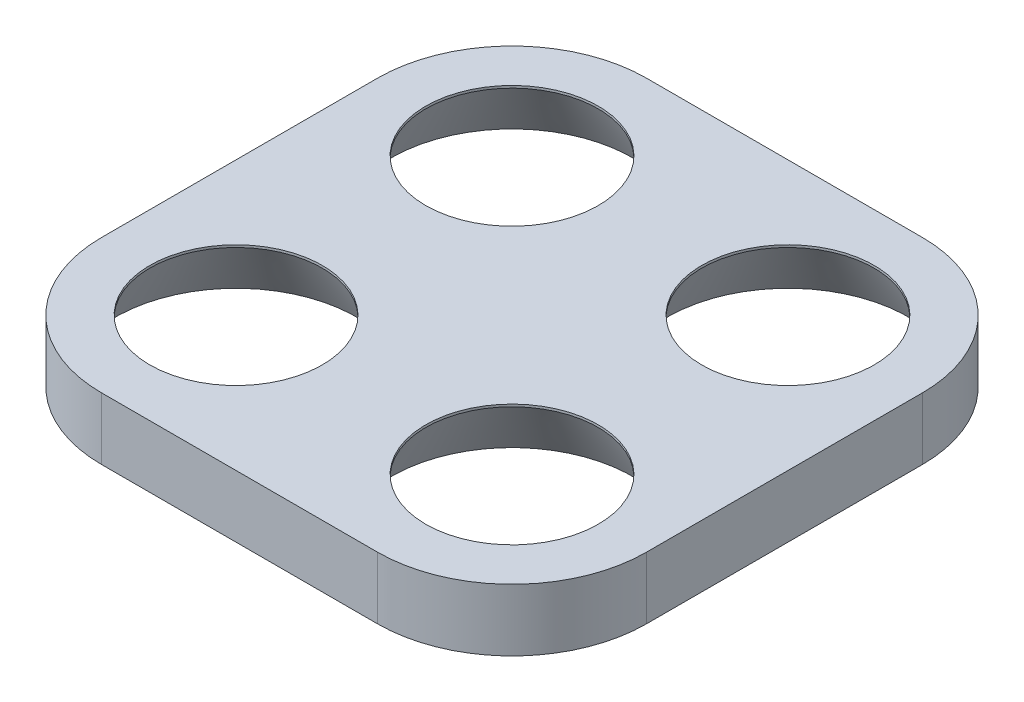
ISO-10303-21;
HEADER;
FILE_DESCRIPTION(('STEP AP214'),'2;1');
FILE_NAME('part.step','',(''),(''),'','','');
FILE_SCHEMA(('AUTOMOTIVE_DESIGN { 1 0 10303 214 1 1 1 1 }'));
ENDSEC;
DATA;
#1=APPLICATION_CONTEXT('core data for automotive mechanical design processes');
#2=APPLICATION_PROTOCOL_DEFINITION('international standard','automotive_design',2000,#1);
#3=PRODUCT_CONTEXT('',#1,'mechanical');
#4=PRODUCT('Part','Part','',(#3));
#5=PRODUCT_RELATED_PRODUCT_CATEGORY('part','',(#4));
#6=PRODUCT_DEFINITION_FORMATION('','',#4);
#7=PRODUCT_DEFINITION_CONTEXT('part definition',#1,'design');
#8=PRODUCT_DEFINITION('design','',#6,#7);
#9=PRODUCT_DEFINITION_SHAPE('','',#8);
#10=(LENGTH_UNIT() NAMED_UNIT(*) SI_UNIT(.MILLI.,.METRE.));
#11=(NAMED_UNIT(*) PLANE_ANGLE_UNIT() SI_UNIT($,.RADIAN.));
#12=(NAMED_UNIT(*) SI_UNIT($,.STERADIAN.) SOLID_ANGLE_UNIT());
#13=UNCERTAINTY_MEASURE_WITH_UNIT(LENGTH_MEASURE(1.E-05),#10,'distance_accuracy_value','');
#14=(GEOMETRIC_REPRESENTATION_CONTEXT(3) GLOBAL_UNCERTAINTY_ASSIGNED_CONTEXT((#13)) GLOBAL_UNIT_ASSIGNED_CONTEXT((#10,
#11,#12)) REPRESENTATION_CONTEXT('',''));
#15=CARTESIAN_POINT('',(0.,0.,0.));
#16=DIRECTION('',(0.,0.,1.));
#17=DIRECTION('',(1.,0.,0.));
#18=AXIS2_PLACEMENT_3D('',#15,#16,#17);
#19=CARTESIAN_POINT('',(-7.9,1.8,7.9));
#20=DIRECTION('',(1.,0.,0.));
#21=DIRECTION('',(0.,0.,-1.));
#22=AXIS2_PLACEMENT_3D('',#19,#20,#21);
#23=PLANE('',#22);
#24=DIRECTION('',(0.,0.,1.));
#25=VECTOR('',#24,1.);
#26=CARTESIAN_POINT('',(-7.9,0.,7.9));
#27=LINE('',#26,#25);
#28=CARTESIAN_POINT('',(-7.9,0.,-4.));
#29=VERTEX_POINT('',#28);
#30=CARTESIAN_POINT('',(-7.9,0.,4.));
#31=VERTEX_POINT('',#30);
#32=EDGE_CURVE('E127',#29,#31,#27,.T.);
#33=ORIENTED_EDGE('',*,*,#32,.T.);
#34=DIRECTION('',(0.,-1.,0.));
#35=VECTOR('',#34,1.);
#36=CARTESIAN_POINT('',(-7.9,1.8,4.));
#37=LINE('',#36,#35);
#38=CARTESIAN_POINT('',(-7.9,1.8,4.));
#39=VERTEX_POINT('',#38);
#40=EDGE_CURVE('E105',#31,#39,#37,.F.);
#41=ORIENTED_EDGE('',*,*,#40,.T.);
#42=DIRECTION('',(0.,0.,1.));
#43=VECTOR('',#42,1.);
#44=CARTESIAN_POINT('',(-7.9,1.8,7.9));
#45=LINE('',#44,#43);
#46=CARTESIAN_POINT('',(-7.9,1.8,-4.));
#47=VERTEX_POINT('',#46);
#48=EDGE_CURVE('E137',#47,#39,#45,.T.);
#49=ORIENTED_EDGE('',*,*,#48,.F.);
#50=DIRECTION('',(0.,-1.,0.));
#51=VECTOR('',#50,1.);
#52=CARTESIAN_POINT('',(-7.9,1.8,-4.));
#53=LINE('',#52,#51);
#54=EDGE_CURVE('E110',#47,#29,#53,.T.);
#55=ORIENTED_EDGE('',*,*,#54,.T.);
#56=EDGE_LOOP('',(#33,#41,#49,#55));
#57=FACE_BOUND('',#56,.T.);
#58=ADVANCED_FACE('F33',(#57),#23,.F.);
#59=CARTESIAN_POINT('',(7.9,1.8,7.9));
#60=DIRECTION('',(0.,0.,-1.));
#61=DIRECTION('',(-1.,0.,0.));
#62=AXIS2_PLACEMENT_3D('',#59,#60,#61);
#63=PLANE('',#62);
#64=DIRECTION('',(1.,0.,0.));
#65=VECTOR('',#64,1.);
#66=CARTESIAN_POINT('',(7.9,1.8,7.9));
#67=LINE('',#66,#65);
#68=CARTESIAN_POINT('',(-4.,1.8,7.9));
#69=VERTEX_POINT('',#68);
#70=CARTESIAN_POINT('',(4.,1.8,7.9));
#71=VERTEX_POINT('',#70);
#72=EDGE_CURVE('E120',#69,#71,#67,.T.);
#73=ORIENTED_EDGE('',*,*,#72,.F.);
#74=DIRECTION('',(0.,-1.,0.));
#75=VECTOR('',#74,1.);
#76=CARTESIAN_POINT('',(-4.,1.8,7.9));
#77=LINE('',#76,#75);
#78=CARTESIAN_POINT('',(-4.,0.,7.9));
#79=VERTEX_POINT('',#78);
#80=EDGE_CURVE('E104',#69,#79,#77,.T.);
#81=ORIENTED_EDGE('',*,*,#80,.T.);
#82=DIRECTION('',(1.,0.,0.));
#83=VECTOR('',#82,1.);
#84=CARTESIAN_POINT('',(7.9,0.,7.9));
#85=LINE('',#84,#83);
#86=CARTESIAN_POINT('',(4.,0.,7.9));
#87=VERTEX_POINT('',#86);
#88=EDGE_CURVE('E117',#79,#87,#85,.T.);
#89=ORIENTED_EDGE('',*,*,#88,.T.);
#90=DIRECTION('',(0.,-1.,0.));
#91=VECTOR('',#90,1.);
#92=CARTESIAN_POINT('',(4.,1.8,7.9));
#93=LINE('',#92,#91);
#94=EDGE_CURVE('E122',#87,#71,#93,.F.);
#95=ORIENTED_EDGE('',*,*,#94,.T.);
#96=EDGE_LOOP('',(#73,#81,#89,#95));
#97=FACE_BOUND('',#96,.T.);
#98=ADVANCED_FACE('F116',(#97),#63,.F.);
#99=CARTESIAN_POINT('',(7.9,1.8,7.9));
#100=DIRECTION('',(-1.,0.,0.));
#101=DIRECTION('',(0.,0.,1.));
#102=AXIS2_PLACEMENT_3D('',#99,#100,#101);
#103=PLANE('',#102);
#104=DIRECTION('',(0.,0.,-1.));
#105=VECTOR('',#104,1.);
#106=CARTESIAN_POINT('',(7.9,1.8,7.9));
#107=LINE('',#106,#105);
#108=CARTESIAN_POINT('',(7.9,1.8,4.));
#109=VERTEX_POINT('',#108);
#110=CARTESIAN_POINT('',(7.9,1.8,-4.));
#111=VERTEX_POINT('',#110);
#112=EDGE_CURVE('E254',#109,#111,#107,.T.);
#113=ORIENTED_EDGE('',*,*,#112,.F.);
#114=DIRECTION('',(0.,-1.,0.));
#115=VECTOR('',#114,1.);
#116=CARTESIAN_POINT('',(7.9,1.8,4.));
#117=LINE('',#116,#115);
#118=CARTESIAN_POINT('',(7.9,0.,4.));
#119=VERTEX_POINT('',#118);
#120=EDGE_CURVE('E156',#109,#119,#117,.T.);
#121=ORIENTED_EDGE('',*,*,#120,.T.);
#122=DIRECTION('',(0.,0.,-1.));
#123=VECTOR('',#122,1.);
#124=CARTESIAN_POINT('',(7.9,0.,7.9));
#125=LINE('',#124,#123);
#126=CARTESIAN_POINT('',(7.9,0.,-4.));
#127=VERTEX_POINT('',#126);
#128=EDGE_CURVE('E126',#119,#127,#125,.T.);
#129=ORIENTED_EDGE('',*,*,#128,.T.);
#130=DIRECTION('',(0.,-1.,0.));
#131=VECTOR('',#130,1.);
#132=CARTESIAN_POINT('',(7.9,1.8,-4.));
#133=LINE('',#132,#131);
#134=EDGE_CURVE('E154',#127,#111,#133,.F.);
#135=ORIENTED_EDGE('',*,*,#134,.T.);
#136=EDGE_LOOP('',(#113,#121,#129,#135));
#137=FACE_BOUND('',#136,.T.);
#138=ADVANCED_FACE('F205',(#137),#103,.F.);
#139=CARTESIAN_POINT('',(7.9,1.8,-7.9));
#140=DIRECTION('',(0.,0.,1.));
#141=DIRECTION('',(1.,0.,0.));
#142=AXIS2_PLACEMENT_3D('',#139,#140,#141);
#143=PLANE('',#142);
#144=DIRECTION('',(-1.,0.,0.));
#145=VECTOR('',#144,1.);
#146=CARTESIAN_POINT('',(7.9,1.8,-7.9));
#147=LINE('',#146,#145);
#148=CARTESIAN_POINT('',(4.,1.8,-7.9));
#149=VERTEX_POINT('',#148);
#150=CARTESIAN_POINT('',(-4.,1.8,-7.9));
#151=VERTEX_POINT('',#150);
#152=EDGE_CURVE('E138',#149,#151,#147,.T.);
#153=ORIENTED_EDGE('',*,*,#152,.F.);
#154=DIRECTION('',(0.,-1.,0.));
#155=VECTOR('',#154,1.);
#156=CARTESIAN_POINT('',(4.,1.8,-7.9));
#157=LINE('',#156,#155);
#158=CARTESIAN_POINT('',(4.,0.,-7.9));
#159=VERTEX_POINT('',#158);
#160=EDGE_CURVE('E160',#149,#159,#157,.T.);
#161=ORIENTED_EDGE('',*,*,#160,.T.);
#162=DIRECTION('',(-1.,0.,0.));
#163=VECTOR('',#162,1.);
#164=CARTESIAN_POINT('',(7.9,0.,-7.9));
#165=LINE('',#164,#163);
#166=CARTESIAN_POINT('',(-4.,0.,-7.9));
#167=VERTEX_POINT('',#166);
#168=EDGE_CURVE('E130',#159,#167,#165,.T.);
#169=ORIENTED_EDGE('',*,*,#168,.T.);
#170=DIRECTION('',(0.,-1.,0.));
#171=VECTOR('',#170,1.);
#172=CARTESIAN_POINT('',(-4.,1.8,-7.9));
#173=LINE('',#172,#171);
#174=EDGE_CURVE('E48',#167,#151,#173,.F.);
#175=ORIENTED_EDGE('',*,*,#174,.T.);
#176=EDGE_LOOP('',(#153,#161,#169,#175));
#177=FACE_BOUND('',#176,.T.);
#178=ADVANCED_FACE('F261',(#177),#143,.F.);
#179=CARTESIAN_POINT('',(0.,1.8,0.));
#180=DIRECTION('',(0.,1.,0.));
#181=DIRECTION('',(0.,0.,1.));
#182=AXIS2_PLACEMENT_3D('',#179,#180,#181);
#183=PLANE('',#182);
#184=CARTESIAN_POINT('',(-4.,1.8,4.));
#185=DIRECTION('',(0.,1.,0.));
#186=DIRECTION('',(0.,0.,1.));
#187=AXIS2_PLACEMENT_3D('',#184,#185,#186);
#188=CIRCLE('',#187,2.5);
#189=CARTESIAN_POINT('',(-4.,1.8,6.5));
#190=VERTEX_POINT('',#189);
#191=EDGE_CURVE('E246',#190,#190,#188,.T.);
#192=ORIENTED_EDGE('',*,*,#191,.F.);
#193=EDGE_LOOP('',(#192));
#194=FACE_BOUND('',#193,.T.);
#195=CARTESIAN_POINT('',(4.,1.8,4.));
#196=DIRECTION('',(0.,1.,0.));
#197=DIRECTION('',(0.,0.,1.));
#198=AXIS2_PLACEMENT_3D('',#195,#196,#197);
#199=CIRCLE('',#198,2.5);
#200=CARTESIAN_POINT('',(4.,1.8,6.5));
#201=VERTEX_POINT('',#200);
#202=EDGE_CURVE('E241',#201,#201,#199,.T.);
#203=ORIENTED_EDGE('',*,*,#202,.F.);
#204=EDGE_LOOP('',(#203));
#205=FACE_BOUND('',#204,.T.);
#206=CARTESIAN_POINT('',(4.,1.8,-4.));
#207=DIRECTION('',(0.,1.,0.));
#208=DIRECTION('',(0.,0.,1.));
#209=AXIS2_PLACEMENT_3D('',#206,#207,#208);
#210=CIRCLE('',#209,2.5);
#211=CARTESIAN_POINT('',(4.,1.8,-1.5));
#212=VERTEX_POINT('',#211);
#213=EDGE_CURVE('E239',#212,#212,#210,.T.);
#214=ORIENTED_EDGE('',*,*,#213,.F.);
#215=EDGE_LOOP('',(#214));
#216=FACE_BOUND('',#215,.T.);
#217=CARTESIAN_POINT('',(-4.,1.8,-4.));
#218=DIRECTION('',(0.,1.,0.));
#219=DIRECTION('',(0.,0.,1.));
#220=AXIS2_PLACEMENT_3D('',#217,#218,#219);
#221=CIRCLE('',#220,2.5);
#222=CARTESIAN_POINT('',(-4.,1.8,-1.5));
#223=VERTEX_POINT('',#222);
#224=EDGE_CURVE('E132',#223,#223,#221,.T.);
#225=ORIENTED_EDGE('',*,*,#224,.F.);
#226=EDGE_LOOP('',(#225));
#227=FACE_BOUND('',#226,.T.);
#228=ORIENTED_EDGE('',*,*,#48,.T.);
#229=CARTESIAN_POINT('',(-4.,1.8,4.));
#230=DIRECTION('',(0.,1.,0.));
#231=DIRECTION('',(0.,0.,1.));
#232=AXIS2_PLACEMENT_3D('',#229,#230,#231);
#233=CIRCLE('',#232,3.9);
#234=EDGE_CURVE('E152',#39,#69,#233,.T.);
#235=ORIENTED_EDGE('',*,*,#234,.T.);
#236=ORIENTED_EDGE('',*,*,#72,.T.);
#237=CARTESIAN_POINT('',(4.,1.8,4.));
#238=DIRECTION('',(0.,1.,0.));
#239=DIRECTION('',(0.,0.,1.));
#240=AXIS2_PLACEMENT_3D('',#237,#238,#239);
#241=CIRCLE('',#240,3.9);
#242=EDGE_CURVE('E150',#71,#109,#241,.T.);
#243=ORIENTED_EDGE('',*,*,#242,.T.);
#244=ORIENTED_EDGE('',*,*,#112,.T.);
#245=CARTESIAN_POINT('',(4.,1.8,-4.));
#246=DIRECTION('',(0.,1.,0.));
#247=DIRECTION('',(0.,0.,1.));
#248=AXIS2_PLACEMENT_3D('',#245,#246,#247);
#249=CIRCLE('',#248,3.9);
#250=EDGE_CURVE('E55',#111,#149,#249,.T.);
#251=ORIENTED_EDGE('',*,*,#250,.T.);
#252=ORIENTED_EDGE('',*,*,#152,.T.);
#253=CARTESIAN_POINT('',(-4.,1.8,-4.));
#254=DIRECTION('',(0.,1.,0.));
#255=DIRECTION('',(0.,0.,1.));
#256=AXIS2_PLACEMENT_3D('',#253,#254,#255);
#257=CIRCLE('',#256,3.9);
#258=EDGE_CURVE('E147',#151,#47,#257,.T.);
#259=ORIENTED_EDGE('',*,*,#258,.T.);
#260=EDGE_LOOP('',(#228,#235,#236,#243,#244,#251,#252,#259));
#261=FACE_BOUND('',#260,.T.);
#262=ADVANCED_FACE('F256',(#194,#205,#216,#227,#261),#183,.T.);
#263=CARTESIAN_POINT('',(0.,0.,0.));
#264=DIRECTION('',(0.,1.,0.));
#265=DIRECTION('',(0.,0.,1.));
#266=AXIS2_PLACEMENT_3D('',#263,#264,#265);
#267=PLANE('',#266);
#268=CARTESIAN_POINT('',(4.,0.,-4.));
#269=DIRECTION('',(0.,1.,0.));
#270=DIRECTION('',(0.,0.,1.));
#271=AXIS2_PLACEMENT_3D('',#268,#269,#270);
#272=CIRCLE('',#271,3.50000000000001);
#273=CARTESIAN_POINT('',(4.,0.,-0.499999999999994));
#274=VERTEX_POINT('',#273);
#275=EDGE_CURVE('E175',#274,#274,#272,.T.);
#276=ORIENTED_EDGE('',*,*,#275,.T.);
#277=EDGE_LOOP('',(#276));
#278=FACE_BOUND('',#277,.T.);
#279=CARTESIAN_POINT('',(4.,0.,4.));
#280=DIRECTION('',(0.,1.,0.));
#281=DIRECTION('',(0.,0.,1.));
#282=AXIS2_PLACEMENT_3D('',#279,#280,#281);
#283=CIRCLE('',#282,3.5);
#284=CARTESIAN_POINT('',(4.,0.,7.5));
#285=VERTEX_POINT('',#284);
#286=EDGE_CURVE('E172',#285,#285,#283,.T.);
#287=ORIENTED_EDGE('',*,*,#286,.T.);
#288=EDGE_LOOP('',(#287));
#289=FACE_BOUND('',#288,.T.);
#290=CARTESIAN_POINT('',(-4.,0.,-4.));
#291=DIRECTION('',(0.,1.,0.));
#292=DIRECTION('',(0.,0.,1.));
#293=AXIS2_PLACEMENT_3D('',#290,#291,#292);
#294=CIRCLE('',#293,3.50000000000001);
#295=CARTESIAN_POINT('',(-4.,0.,-0.499999999999994));
#296=VERTEX_POINT('',#295);
#297=EDGE_CURVE('E169',#296,#296,#294,.T.);
#298=ORIENTED_EDGE('',*,*,#297,.T.);
#299=EDGE_LOOP('',(#298));
#300=FACE_BOUND('',#299,.T.);
#301=CARTESIAN_POINT('',(-4.,0.,4.));
#302=DIRECTION('',(0.,1.,0.));
#303=DIRECTION('',(0.,0.,1.));
#304=AXIS2_PLACEMENT_3D('',#301,#302,#303);
#305=CIRCLE('',#304,3.50000000000001);
#306=CARTESIAN_POINT('',(-4.,0.,7.50000000000001));
#307=VERTEX_POINT('',#306);
#308=EDGE_CURVE('E166',#307,#307,#305,.T.);
#309=ORIENTED_EDGE('',*,*,#308,.T.);
#310=EDGE_LOOP('',(#309));
#311=FACE_BOUND('',#310,.T.);
#312=ORIENTED_EDGE('',*,*,#88,.F.);
#313=CARTESIAN_POINT('',(-4.,0.,4.));
#314=DIRECTION('',(0.,1.,0.));
#315=DIRECTION('',(0.,0.,1.));
#316=AXIS2_PLACEMENT_3D('',#313,#314,#315);
#317=CIRCLE('',#316,3.9);
#318=EDGE_CURVE('E100',#79,#31,#317,.F.);
#319=ORIENTED_EDGE('',*,*,#318,.T.);
#320=ORIENTED_EDGE('',*,*,#32,.F.);
#321=CARTESIAN_POINT('',(-4.,0.,-4.));
#322=DIRECTION('',(0.,1.,0.));
#323=DIRECTION('',(0.,0.,1.));
#324=AXIS2_PLACEMENT_3D('',#321,#322,#323);
#325=CIRCLE('',#324,3.9);
#326=EDGE_CURVE('E121',#29,#167,#325,.F.);
#327=ORIENTED_EDGE('',*,*,#326,.T.);
#328=ORIENTED_EDGE('',*,*,#168,.F.);
#329=CARTESIAN_POINT('',(4.,0.,-4.));
#330=DIRECTION('',(0.,1.,0.));
#331=DIRECTION('',(0.,0.,1.));
#332=AXIS2_PLACEMENT_3D('',#329,#330,#331);
#333=CIRCLE('',#332,3.9);
#334=EDGE_CURVE('E141',#159,#127,#333,.F.);
#335=ORIENTED_EDGE('',*,*,#334,.T.);
#336=ORIENTED_EDGE('',*,*,#128,.F.);
#337=CARTESIAN_POINT('',(4.,0.,4.));
#338=DIRECTION('',(0.,1.,0.));
#339=DIRECTION('',(0.,0.,1.));
#340=AXIS2_PLACEMENT_3D('',#337,#338,#339);
#341=CIRCLE('',#340,3.9);
#342=EDGE_CURVE('E111',#119,#87,#341,.F.);
#343=ORIENTED_EDGE('',*,*,#342,.T.);
#344=EDGE_LOOP('',(#312,#319,#320,#327,#328,#335,#336,#343));
#345=FACE_BOUND('',#344,.T.);
#346=ADVANCED_FACE('F124',(#278,#289,#300,#311,#345),#267,.F.);
#347=CARTESIAN_POINT('',(-4.,-0.000999999999999916,-4.));
#348=DIRECTION('',(0.,1.,0.));
#349=DIRECTION('',(0.,0.,1.));
#350=AXIS2_PLACEMENT_3D('',#347,#348,#349);
#351=CYLINDRICAL_SURFACE('',#350,2.5);
#352=CARTESIAN_POINT('',(-4.,1.73205080756888,-4.));
#353=DIRECTION('',(0.,1.,0.));
#354=DIRECTION('',(0.,0.,1.));
#355=AXIS2_PLACEMENT_3D('',#352,#353,#354);
#356=CIRCLE('',#355,2.5);
#357=CARTESIAN_POINT('',(-4.,1.73205080756888,-1.5));
#358=VERTEX_POINT('',#357);
#359=EDGE_CURVE('E41',#358,#358,#356,.F.);
#360=ORIENTED_EDGE('',*,*,#359,.T.);
#361=EDGE_LOOP('',(#360));
#362=FACE_BOUND('',#361,.T.);
#363=ORIENTED_EDGE('',*,*,#224,.T.);
#364=EDGE_LOOP('',(#363));
#365=FACE_BOUND('',#364,.T.);
#366=ADVANCED_FACE('F183',(#362,#365),#351,.F.);
#367=CARTESIAN_POINT('',(4.,-0.000999999999999916,-4.));
#368=DIRECTION('',(0.,1.,0.));
#369=DIRECTION('',(0.,0.,1.));
#370=AXIS2_PLACEMENT_3D('',#367,#368,#369);
#371=CYLINDRICAL_SURFACE('',#370,2.5);
#372=CARTESIAN_POINT('',(4.,1.73205080756888,-4.));
#373=DIRECTION('',(0.,1.,0.));
#374=DIRECTION('',(0.,0.,1.));
#375=AXIS2_PLACEMENT_3D('',#372,#373,#374);
#376=CIRCLE('',#375,2.5);
#377=CARTESIAN_POINT('',(4.,1.73205080756888,-1.5));
#378=VERTEX_POINT('',#377);
#379=EDGE_CURVE('E163',#378,#378,#376,.F.);
#380=ORIENTED_EDGE('',*,*,#379,.T.);
#381=EDGE_LOOP('',(#380));
#382=FACE_BOUND('',#381,.T.);
#383=ORIENTED_EDGE('',*,*,#213,.T.);
#384=EDGE_LOOP('',(#383));
#385=FACE_BOUND('',#384,.T.);
#386=ADVANCED_FACE('F232',(#382,#385),#371,.F.);
#387=CARTESIAN_POINT('',(4.,-0.000999999999999916,4.));
#388=DIRECTION('',(0.,1.,0.));
#389=DIRECTION('',(0.,0.,1.));
#390=AXIS2_PLACEMENT_3D('',#387,#388,#389);
#391=CYLINDRICAL_SURFACE('',#390,2.5);
#392=CARTESIAN_POINT('',(4.,1.73205080756887,4.));
#393=DIRECTION('',(0.,1.,0.));
#394=DIRECTION('',(0.,0.,1.));
#395=AXIS2_PLACEMENT_3D('',#392,#393,#394);
#396=CIRCLE('',#395,2.5);
#397=CARTESIAN_POINT('',(4.,1.73205080756887,6.5));
#398=VERTEX_POINT('',#397);
#399=EDGE_CURVE('E178',#398,#398,#396,.F.);
#400=ORIENTED_EDGE('',*,*,#399,.T.);
#401=EDGE_LOOP('',(#400));
#402=FACE_BOUND('',#401,.T.);
#403=ORIENTED_EDGE('',*,*,#202,.T.);
#404=EDGE_LOOP('',(#403));
#405=FACE_BOUND('',#404,.T.);
#406=ADVANCED_FACE('F235',(#402,#405),#391,.F.);
#407=CARTESIAN_POINT('',(-4.,-0.000999999999999916,4.));
#408=DIRECTION('',(0.,1.,0.));
#409=DIRECTION('',(0.,0.,1.));
#410=AXIS2_PLACEMENT_3D('',#407,#408,#409);
#411=CYLINDRICAL_SURFACE('',#410,2.5);
#412=CARTESIAN_POINT('',(-4.,1.73205080756888,4.));
#413=DIRECTION('',(0.,1.,0.));
#414=DIRECTION('',(0.,0.,1.));
#415=AXIS2_PLACEMENT_3D('',#412,#413,#414);
#416=CIRCLE('',#415,2.5);
#417=CARTESIAN_POINT('',(-4.,1.73205080756888,6.5));
#418=VERTEX_POINT('',#417);
#419=EDGE_CURVE('E11',#418,#418,#416,.F.);
#420=ORIENTED_EDGE('',*,*,#419,.T.);
#421=EDGE_LOOP('',(#420));
#422=FACE_BOUND('',#421,.T.);
#423=ORIENTED_EDGE('',*,*,#191,.T.);
#424=EDGE_LOOP('',(#423));
#425=FACE_BOUND('',#424,.T.);
#426=ADVANCED_FACE('F212',(#422,#425),#411,.F.);
#427=CARTESIAN_POINT('',(-4.,1.8,4.));
#428=DIRECTION('',(0.,-1.,0.));
#429=DIRECTION('',(0.,0.,-1.));
#430=AXIS2_PLACEMENT_3D('',#427,#428,#429);
#431=CYLINDRICAL_SURFACE('',#430,3.9);
#432=ORIENTED_EDGE('',*,*,#234,.F.);
#433=ORIENTED_EDGE('',*,*,#40,.F.);
#434=ORIENTED_EDGE('',*,*,#318,.F.);
#435=ORIENTED_EDGE('',*,*,#80,.F.);
#436=EDGE_LOOP('',(#432,#433,#434,#435));
#437=FACE_BOUND('',#436,.T.);
#438=ADVANCED_FACE('F103',(#437),#431,.T.);
#439=CARTESIAN_POINT('',(4.,1.8,4.));
#440=DIRECTION('',(0.,-1.,0.));
#441=DIRECTION('',(0.,0.,-1.));
#442=AXIS2_PLACEMENT_3D('',#439,#440,#441);
#443=CYLINDRICAL_SURFACE('',#442,3.9);
#444=ORIENTED_EDGE('',*,*,#242,.F.);
#445=ORIENTED_EDGE('',*,*,#94,.F.);
#446=ORIENTED_EDGE('',*,*,#342,.F.);
#447=ORIENTED_EDGE('',*,*,#120,.F.);
#448=EDGE_LOOP('',(#444,#445,#446,#447));
#449=FACE_BOUND('',#448,.T.);
#450=ADVANCED_FACE('F211',(#449),#443,.T.);
#451=CARTESIAN_POINT('',(4.,1.8,-4.));
#452=DIRECTION('',(0.,-1.,0.));
#453=DIRECTION('',(0.,0.,-1.));
#454=AXIS2_PLACEMENT_3D('',#451,#452,#453);
#455=CYLINDRICAL_SURFACE('',#454,3.9);
#456=ORIENTED_EDGE('',*,*,#250,.F.);
#457=ORIENTED_EDGE('',*,*,#134,.F.);
#458=ORIENTED_EDGE('',*,*,#334,.F.);
#459=ORIENTED_EDGE('',*,*,#160,.F.);
#460=EDGE_LOOP('',(#456,#457,#458,#459));
#461=FACE_BOUND('',#460,.T.);
#462=ADVANCED_FACE('F215',(#461),#455,.T.);
#463=CARTESIAN_POINT('',(-4.,1.8,-4.));
#464=DIRECTION('',(0.,-1.,0.));
#465=DIRECTION('',(0.,0.,-1.));
#466=AXIS2_PLACEMENT_3D('',#463,#464,#465);
#467=CYLINDRICAL_SURFACE('',#466,3.9);
#468=ORIENTED_EDGE('',*,*,#258,.F.);
#469=ORIENTED_EDGE('',*,*,#174,.F.);
#470=ORIENTED_EDGE('',*,*,#326,.F.);
#471=ORIENTED_EDGE('',*,*,#54,.F.);
#472=EDGE_LOOP('',(#468,#469,#470,#471));
#473=FACE_BOUND('',#472,.T.);
#474=ADVANCED_FACE('F219',(#473),#467,.T.);
#475=CARTESIAN_POINT('',(4.,1.73205080756888,-4.));
#476=DIRECTION('',(0.,-1.,0.));
#477=DIRECTION('',(0.,0.,-1.));
#478=AXIS2_PLACEMENT_3D('',#475,#476,#477);
#479=CONICAL_SURFACE('',#478,2.5,0.5235987755983);
#480=ORIENTED_EDGE('',*,*,#275,.F.);
#481=EDGE_LOOP('',(#480));
#482=FACE_BOUND('',#481,.T.);
#483=ORIENTED_EDGE('',*,*,#379,.F.);
#484=EDGE_LOOP('',(#483));
#485=FACE_BOUND('',#484,.T.);
#486=ADVANCED_FACE('F195',(#482,#485),#479,.F.);
#487=CARTESIAN_POINT('',(4.,1.73205080756887,4.));
#488=DIRECTION('',(0.,-1.,0.));
#489=DIRECTION('',(0.,0.,-1.));
#490=AXIS2_PLACEMENT_3D('',#487,#488,#489);
#491=CONICAL_SURFACE('',#490,2.5,0.5235987755983);
#492=ORIENTED_EDGE('',*,*,#286,.F.);
#493=EDGE_LOOP('',(#492));
#494=FACE_BOUND('',#493,.T.);
#495=ORIENTED_EDGE('',*,*,#399,.F.);
#496=EDGE_LOOP('',(#495));
#497=FACE_BOUND('',#496,.T.);
#498=ADVANCED_FACE('F188',(#494,#497),#491,.F.);
#499=CARTESIAN_POINT('',(-4.,1.73205080756888,-4.));
#500=DIRECTION('',(0.,-1.,0.));
#501=DIRECTION('',(0.,0.,-1.));
#502=AXIS2_PLACEMENT_3D('',#499,#500,#501);
#503=CONICAL_SURFACE('',#502,2.5,0.5235987755983);
#504=ORIENTED_EDGE('',*,*,#297,.F.);
#505=EDGE_LOOP('',(#504));
#506=FACE_BOUND('',#505,.T.);
#507=ORIENTED_EDGE('',*,*,#359,.F.);
#508=EDGE_LOOP('',(#507));
#509=FACE_BOUND('',#508,.T.);
#510=ADVANCED_FACE('F186',(#506,#509),#503,.F.);
#511=CARTESIAN_POINT('',(-4.,1.73205080756888,4.));
#512=DIRECTION('',(0.,-1.,0.));
#513=DIRECTION('',(0.,0.,-1.));
#514=AXIS2_PLACEMENT_3D('',#511,#512,#513);
#515=CONICAL_SURFACE('',#514,2.5,0.5235987755983);
#516=ORIENTED_EDGE('',*,*,#308,.F.);
#517=EDGE_LOOP('',(#516));
#518=FACE_BOUND('',#517,.T.);
#519=ORIENTED_EDGE('',*,*,#419,.F.);
#520=EDGE_LOOP('',(#519));
#521=FACE_BOUND('',#520,.T.);
#522=ADVANCED_FACE('F35',(#518,#521),#515,.F.);
#523=CLOSED_SHELL('',(#58,#98,#138,#178,#262,#346,#366,#386,#406,#426,#438,#450,#462,#474,#486,
#498,#510,#522));
#524=MANIFOLD_SOLID_BREP('B2',#523);
#525=ADVANCED_BREP_SHAPE_REPRESENTATION('',(#18,#524),#14);
#526=SHAPE_DEFINITION_REPRESENTATION(#9,#525);
ENDSEC;
END-ISO-10303-21;
